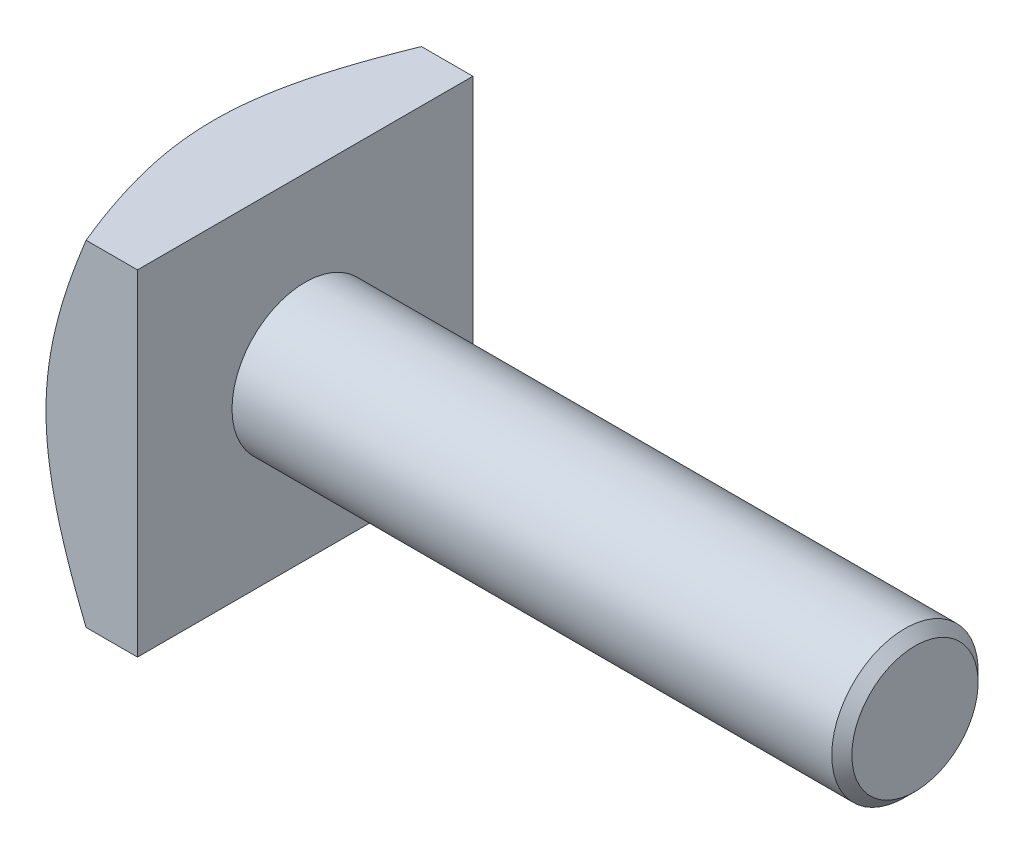
ISO-10303-21;
HEADER;
FILE_DESCRIPTION(('STEP AP214'),'2;1');
FILE_NAME('part.step','',(''),(''),'','','');
FILE_SCHEMA(('AUTOMOTIVE_DESIGN { 1 0 10303 214 1 1 1 1 }'));
ENDSEC;
DATA;
#1=APPLICATION_CONTEXT('core data for automotive mechanical design processes');
#2=APPLICATION_PROTOCOL_DEFINITION('international standard','automotive_design',2000,#1);
#3=PRODUCT_CONTEXT('',#1,'mechanical');
#4=PRODUCT('Part','Part','',(#3));
#5=PRODUCT_RELATED_PRODUCT_CATEGORY('part','',(#4));
#6=PRODUCT_DEFINITION_FORMATION('','',#4);
#7=PRODUCT_DEFINITION_CONTEXT('part definition',#1,'design');
#8=PRODUCT_DEFINITION('design','',#6,#7);
#9=PRODUCT_DEFINITION_SHAPE('','',#8);
#10=(LENGTH_UNIT() NAMED_UNIT(*) SI_UNIT(.MILLI.,.METRE.));
#11=(NAMED_UNIT(*) PLANE_ANGLE_UNIT() SI_UNIT($,.RADIAN.));
#12=(NAMED_UNIT(*) SI_UNIT($,.STERADIAN.) SOLID_ANGLE_UNIT());
#13=UNCERTAINTY_MEASURE_WITH_UNIT(LENGTH_MEASURE(1.E-05),#10,'distance_accuracy_value','');
#14=(GEOMETRIC_REPRESENTATION_CONTEXT(3) GLOBAL_UNCERTAINTY_ASSIGNED_CONTEXT((#13)) GLOBAL_UNIT_ASSIGNED_CONTEXT((#10,
#11,#12)) REPRESENTATION_CONTEXT('',''));
#15=CARTESIAN_POINT('',(0.,0.,0.));
#16=DIRECTION('',(0.,0.,1.));
#17=DIRECTION('',(1.,0.,0.));
#18=AXIS2_PLACEMENT_3D('',#15,#16,#17);
#19=CARTESIAN_POINT('',(15.,27.5,27.5));
#20=DIRECTION('',(0.,-1.,0.));
#21=DIRECTION('',(0.,0.,-1.));
#22=AXIS2_PLACEMENT_3D('',#19,#20,#21);
#23=PLANE('',#22);
#24=CARTESIAN_POINT('',(19.2891533938355,27.5,-54.3484403656074));
#25=CARTESIAN_POINT('',(18.9458184447502,27.5,-53.6819659629113));
#26=CARTESIAN_POINT('',(18.6034944439782,27.5,-53.0149710391168));
#27=CARTESIAN_POINT('',(17.9210859545558,27.5,-51.6798335462191));
#28=CARTESIAN_POINT('',(17.5810014742883,27.5,-51.0116909728319));
#29=CARTESIAN_POINT('',(16.5643984349443,27.5,-49.0053120943696));
#30=CARTESIAN_POINT('',(15.8915699938536,27.5,-47.6652016055824));
#31=CARTESIAN_POINT('',(14.5564181133558,27.5,-44.9758303666514));
#32=CARTESIAN_POINT('',(13.8941230365309,27.5,-43.6265555224847));
#33=CARTESIAN_POINT('',(12.5845998954245,27.5,-40.9207246375903));
#34=CARTESIAN_POINT('',(11.9373715231242,27.5,-39.564168746413));
#35=CARTESIAN_POINT('',(10.9630663542633,27.5,-37.4848533283862));
#36=CARTESIAN_POINT('',(10.6291345218302,27.5,-36.7653040431692));
#37=CARTESIAN_POINT('',(9.96729958555114,27.5,-35.3234400850026));
#38=CARTESIAN_POINT('',(9.63939644480553,27.5,-34.6011254290117));
#39=CARTESIAN_POINT('',(8.99043429087637,27.5,-33.1533670455752));
#40=CARTESIAN_POINT('',(8.66937573640514,27.5,-32.4279231123037));
#41=CARTESIAN_POINT('',(8.03511778044157,27.5,-30.9736050586348));
#42=CARTESIAN_POINT('',(7.72191836199072,27.5,-30.2447309456431));
#43=CARTESIAN_POINT('',(7.10481375884509,27.5,-28.7838030365384));
#44=CARTESIAN_POINT('',(6.80090069589717,27.5,-28.0517525733553));
#45=CARTESIAN_POINT('',(6.2034512453973,27.5,-26.5834130184237));
#46=CARTESIAN_POINT('',(5.90991496256234,27.5,-25.8471238839878));
#47=CARTESIAN_POINT('',(5.33486489109638,27.5,-24.3699401979915));
#48=CARTESIAN_POINT('',(5.05334990201111,27.5,-23.6290461147886));
#49=CARTESIAN_POINT('',(4.50421391071972,27.5,-22.1421407971614));
#50=CARTESIAN_POINT('',(4.23659244639665,27.5,-21.3961297338701));
#51=CARTESIAN_POINT('',(3.72031825451335,27.5,-19.9068050824168));
#52=CARTESIAN_POINT('',(3.47148826386457,27.5,-19.1635531323571));
#53=CARTESIAN_POINT('',(2.99205749021409,27.5,-17.6712555667686));
#54=CARTESIAN_POINT('',(2.76145481988805,27.5,-16.9222105599148));
#55=CARTESIAN_POINT('',(2.32125727796496,27.5,-15.4179904684064));
#56=CARTESIAN_POINT('',(2.11166123858363,27.5,-14.6628157270369));
#57=CARTESIAN_POINT('',(1.71648510883737,27.5,-13.1458870540646));
#58=CARTESIAN_POINT('',(1.53091357002427,27.5,-12.3841308821512));
#59=CARTESIAN_POINT('',(1.19051489867189,27.5,-10.8692661102743));
#60=CARTESIAN_POINT('',(1.03516105369305,27.5,-10.1162765420392));
#61=CARTESIAN_POINT('',(0.753974689267168,27.5,-8.60481213018964));
#62=CARTESIAN_POINT('',(0.628140351968641,27.5,-7.84633762731169));
#63=CARTESIAN_POINT('',(0.408972714915332,27.5,-6.32487928122566));
#64=CARTESIAN_POINT('',(0.315630951240227,27.5,-5.5618966650691));
#65=CARTESIAN_POINT('',(0.163897886928817,27.5,-4.03249534637066));
#66=CARTESIAN_POINT('',(0.105502560944068,27.5,-3.2660770498219));
#67=CARTESIAN_POINT('',(0.0411724393830715,27.5,-2.0349416906006));
#68=CARTESIAN_POINT('',(0.0236233132387049,27.5,-1.57080468576335));
#69=CARTESIAN_POINT('',(0.00207140960331185,27.5,-0.642221039917106));
#70=CARTESIAN_POINT('',(-0.0019317933397405,27.5,-0.17777440909115));
#71=CARTESIAN_POINT('',(0.00365633491252517,27.5,0.750991835121613));
#72=CARTESIAN_POINT('',(0.0132464133414229,27.5,1.21531145626937));
#73=CARTESIAN_POINT('',(0.045910875028161,27.5,2.14347939086826));
#74=CARTESIAN_POINT('',(0.0689854019921552,27.5,2.60732769924375));
#75=CARTESIAN_POINT('',(0.128376955017823,27.5,3.53428731510679));
#76=CARTESIAN_POINT('',(0.164697159750129,27.5,3.99739841886591));
#77=CARTESIAN_POINT('',(0.250192546716065,27.5,4.92243936230425));
#78=CARTESIAN_POINT('',(0.299368302481621,27.5,5.38436914835201));
#79=CARTESIAN_POINT('',(0.465466692163715,27.5,6.7679240387054));
#80=CARTESIAN_POINT('',(0.60096411289261,27.5,7.68737025571377));
#81=CARTESIAN_POINT('',(0.92090866704601,27.5,9.54355013412482));
#82=CARTESIAN_POINT('',(1.10659671725914,27.5,10.4800660544476));
#83=CARTESIAN_POINT('',(1.51905836353277,27.5,12.3439711470546));
#84=CARTESIAN_POINT('',(1.74583266961087,27.5,13.2713601613235));
#85=CARTESIAN_POINT('',(2.11237664753352,27.5,14.6555610773524));
#86=CARTESIAN_POINT('',(2.238987194182,27.5,15.1159192967937));
#87=CARTESIAN_POINT('',(2.50030239016658,27.5,16.0343381018087));
#88=CARTESIAN_POINT('',(2.63500703506466,27.5,16.4923986886419));
#89=CARTESIAN_POINT('',(2.91183323761131,27.5,17.406234327352));
#90=CARTESIAN_POINT('',(3.05395430288873,27.5,17.8620095287575));
#91=CARTESIAN_POINT('',(3.34500261076231,27.5,18.7713766461137));
#92=CARTESIAN_POINT('',(3.4939298481326,27.5,19.2249685637404));
#93=CARTESIAN_POINT('',(3.92985785110491,27.5,20.5225041386452));
#94=CARTESIAN_POINT('',(4.2246003215744,27.5,21.3638532083334));
#95=CARTESIAN_POINT('',(4.83246498379457,27.5,23.0399078511448));
#96=CARTESIAN_POINT('',(5.14558833761361,27.5,23.8746130004324));
#97=CARTESIAN_POINT('',(5.78748401731872,27.5,25.5382017544874));
#98=CARTESIAN_POINT('',(6.11626009867335,27.5,26.3670839068773));
#99=CARTESIAN_POINT('',(6.78704116362549,27.5,28.0194458710301));
#100=CARTESIAN_POINT('',(7.12904589555941,27.5,28.8429257852177));
#101=CARTESIAN_POINT('',(7.82467615727796,27.5,30.4858876974526));
#102=CARTESIAN_POINT('',(8.17831254721236,27.5,31.3053650887192));
#103=CARTESIAN_POINT('',(8.89526950579172,27.5,32.940069663424));
#104=CARTESIAN_POINT('',(9.2585901135639,27.5,33.755296829674));
#105=CARTESIAN_POINT('',(9.99351768487795,27.5,35.3818866438478));
#106=CARTESIAN_POINT('',(10.365123664427,27.5,36.1932497369353));
#107=CARTESIAN_POINT('',(11.1155341549093,27.5,37.8126348979688));
#108=CARTESIAN_POINT('',(11.4943386540273,27.5,38.620656971396));
#109=CARTESIAN_POINT('',(12.2594790323328,27.5,40.2364395282703));
#110=CARTESIAN_POINT('',(12.6458358878856,27.5,41.0441900703456));
#111=CARTESIAN_POINT('',(13.4240464742735,27.5,42.6570404282243));
#112=CARTESIAN_POINT('',(13.8159002288107,27.5,43.4621402325795));
#113=CARTESIAN_POINT('',(14.9986724868795,27.5,45.8739334176277));
#114=CARTESIAN_POINT('',(15.7967909834593,27.5,47.4770974428697));
#115=CARTESIAN_POINT('',(17.4074889977398,27.5,50.6750172800065));
#116=CARTESIAN_POINT('',(18.220060317763,27.5,52.2697772326246));
#117=CARTESIAN_POINT('',(19.8569996579239,27.5,55.4532089962213));
#118=CARTESIAN_POINT('',(20.6813675816418,27.5,57.0418808568266));
#119=CARTESIAN_POINT('',(22.227938537501,27.5,60.0006536521141));
#120=CARTESIAN_POINT('',(22.9489499056522,27.5,61.3713782989836));
#121=CARTESIAN_POINT('',(24.3969253120617,27.5,64.1096818457379));
#122=CARTESIAN_POINT('',(25.1238893613718,27.5,65.4772607397762));
#123=CARTESIAN_POINT('',(26.5829525854266,27.5,68.2099451596322));
#124=CARTESIAN_POINT('',(27.3150525323152,27.5,69.5750502729572));
#125=CARTESIAN_POINT('',(28.7835313114381,27.5,72.302957350948));
#126=CARTESIAN_POINT('',(29.5199101463377,27.5,73.6657593141785));
#127=CARTESIAN_POINT('',(30.9913075436608,27.5,76.3800929813567));
#128=CARTESIAN_POINT('',(31.7263011803049,27.5,77.7316382016354));
#129=CARTESIAN_POINT('',(33.1994205632285,27.5,80.4330209271446));
#130=CARTESIAN_POINT('',(33.9375463107573,27.5,81.7828584316936));
#131=CARTESIAN_POINT('',(35.4163878979718,27.5,84.4807988250746));
#132=CARTESIAN_POINT('',(36.1571032496777,27.5,85.8289019814607));
#133=CARTESIAN_POINT('',(37.640926392475,27.5,88.5237882457102));
#134=CARTESIAN_POINT('',(38.3840341796399,27.5,89.8705713557351));
#135=CARTESIAN_POINT('',(39.1281747867843,27.5,91.2167827597177));
#136=B_SPLINE_CURVE_WITH_KNOTS('',3,(#24,#25,#26,#27,#28,#29,#30,#31,#32,#33,#34,#35,#36,#37,
#38,#39,#40,#41,#42,#43,#44,#45,#46,#47,#48,#49,#50,#51,#52,#53,#54,#55,#56,#57,#58,#59,#60,#61,
#62,#63,#64,#65,#66,#67,#68,#69,#70,#71,#72,#73,#74,#75,#76,#77,#78,#79,#80,#81,#82,#83,#84,#85,
#86,#87,#88,#89,#90,#91,#92,#93,#94,#95,#96,#97,#98,#99,#100,#101,#102,#103,#104,#105,#106,#107,
#108,#109,#110,#111,#112,#113,#114,#115,#116,#117,#118,#119,#120,#121,#122,#123,#124,#125,#126,
#127,#128,#129,#130,#131,#132,#133,#134,#135),.UNSPECIFIED.,.F.,.F.,(4,2,2,2,2,2,2,2,2,2,2,2,2,
2,2,2,2,2,2,2,2,2,2,2,2,2,2,2,2,2,2,2,2,2,2,2,2,2,2,2,2,2,2,2,2,2,2,2,2,2,2,2,2,2,2,4),(0.,
2.2491320729525,4.49827255999688,8.99681337923128,13.5059126454325,18.0149196479463,
20.3946776667976,22.7744211150652,25.1543235514143,27.5342208519521,29.9120396626853,
32.2898824622634,34.6674872509384,37.0450129066101,39.3962057141665,41.7471547507148,
44.0979730225591,46.4496257838736,48.7556452282316,51.0615226274723,53.3667989234257,
55.6718096321565,57.0650406243832,58.4582278574329,59.8512867017104,61.2443603923332,
62.6377686101491,64.0312390034812,66.8180129117141,69.681239781468,72.5445161357838,
73.9768128496618,75.4091087782122,76.8413097382785,78.2735095987037,80.9476779010213,
83.6220154509301,86.2969979049348,88.9719294947277,91.6494337461398,94.3269488171325,
97.004147575498,99.6813419400428,102.367503498776,105.053676643584,110.426099759885,
115.795567103035,121.164990583723,125.811337727582,130.457693499837,135.104763463155,
139.751836321485,144.367241792768,148.982649105056,153.597229122809,158.211801571256),.UNSPECIFIED.);
#137=CARTESIAN_POINT('',(6.57652357279771,27.5,27.5));
#138=VERTEX_POINT('',#137);
#139=CARTESIAN_POINT('',(0.,27.5,0.));
#140=VERTEX_POINT('',#139);
#141=EDGE_CURVE('E85',#138,#140,#136,.F.);
#142=ORIENTED_EDGE('',*,*,#141,.F.);
#143=DIRECTION('',(-1.,0.,0.));
#144=VECTOR('',#143,1.);
#145=CARTESIAN_POINT('',(15.,27.5,27.5));
#146=LINE('',#145,#144);
#147=CARTESIAN_POINT('',(15.,27.5,27.5));
#148=VERTEX_POINT('',#147);
#149=EDGE_CURVE('E171',#148,#138,#146,.T.);
#150=ORIENTED_EDGE('',*,*,#149,.F.);
#151=DIRECTION('',(0.,0.,1.));
#152=VECTOR('',#151,1.);
#153=CARTESIAN_POINT('',(15.,27.5,27.5));
#154=LINE('',#153,#152);
#155=CARTESIAN_POINT('',(15.,27.5,-27.5));
#156=VERTEX_POINT('',#155);
#157=EDGE_CURVE('E184',#156,#148,#154,.T.);
#158=ORIENTED_EDGE('',*,*,#157,.F.);
#159=DIRECTION('',(-1.,0.,0.));
#160=VECTOR('',#159,1.);
#161=CARTESIAN_POINT('',(15.,27.5,-27.5));
#162=LINE('',#161,#160);
#163=CARTESIAN_POINT('',(6.57652357279771,27.5,-27.5));
#164=VERTEX_POINT('',#163);
#165=EDGE_CURVE('E110',#156,#164,#162,.T.);
#166=ORIENTED_EDGE('',*,*,#165,.T.);
#167=EDGE_CURVE('E94',#140,#164,#136,.F.);
#168=ORIENTED_EDGE('',*,*,#167,.F.);
#169=EDGE_LOOP('',(#142,#150,#158,#166,#168));
#170=FACE_BOUND('',#169,.T.);
#171=ADVANCED_FACE('F34',(#170),#23,.F.);
#172=CARTESIAN_POINT('',(15.,27.5,27.5));
#173=DIRECTION('',(0.,0.,-1.));
#174=DIRECTION('',(0.,1.,0.));
#175=AXIS2_PLACEMENT_3D('',#172,#173,#174);
#176=PLANE('',#175);
#177=CARTESIAN_POINT('',(19.2891533938355,-54.3484403656074,27.5));
#178=CARTESIAN_POINT('',(18.9458184447502,-53.6819659629113,27.5));
#179=CARTESIAN_POINT('',(18.6034944439782,-53.0149710391168,27.5));
#180=CARTESIAN_POINT('',(17.9210859545558,-51.6798335462191,27.5));
#181=CARTESIAN_POINT('',(17.5810014742883,-51.0116909728319,27.5));
#182=CARTESIAN_POINT('',(16.5643984349443,-49.0053120943696,27.5));
#183=CARTESIAN_POINT('',(15.8915699938536,-47.6652016055824,27.5));
#184=CARTESIAN_POINT('',(14.5564181133559,-44.9758303666514,27.5));
#185=CARTESIAN_POINT('',(13.8941230365309,-43.6265555224847,27.5));
#186=CARTESIAN_POINT('',(12.5845998954245,-40.9207246375903,27.5));
#187=CARTESIAN_POINT('',(11.9373715231242,-39.564168746413,27.5));
#188=CARTESIAN_POINT('',(10.9630663542633,-37.4848533283862,27.5));
#189=CARTESIAN_POINT('',(10.6291345218302,-36.7653040431692,27.5));
#190=CARTESIAN_POINT('',(9.96729958555114,-35.3234400850026,27.5));
#191=CARTESIAN_POINT('',(9.63939644480553,-34.6011254290117,27.5));
#192=CARTESIAN_POINT('',(8.99043429087637,-33.1533670455752,27.5));
#193=CARTESIAN_POINT('',(8.66937573640514,-32.4279231123037,27.5));
#194=CARTESIAN_POINT('',(8.03511778044157,-30.9736050586348,27.5));
#195=CARTESIAN_POINT('',(7.72191836199072,-30.2447309456431,27.5));
#196=CARTESIAN_POINT('',(7.10481375884509,-28.7838030365384,27.5));
#197=CARTESIAN_POINT('',(6.80090069589717,-28.0517525733553,27.5));
#198=CARTESIAN_POINT('',(6.20345124539731,-26.5834130184237,27.5));
#199=CARTESIAN_POINT('',(5.90991496256234,-25.8471238839878,27.5));
#200=CARTESIAN_POINT('',(5.33486489109638,-24.3699401979915,27.5));
#201=CARTESIAN_POINT('',(5.05334990201111,-23.6290461147886,27.5));
#202=CARTESIAN_POINT('',(4.50421391071971,-22.1421407971614,27.5));
#203=CARTESIAN_POINT('',(4.23659244639665,-21.3961297338701,27.5));
#204=CARTESIAN_POINT('',(3.72031825451334,-19.9068050824168,27.5));
#205=CARTESIAN_POINT('',(3.47148826386457,-19.1635531323571,27.5));
#206=CARTESIAN_POINT('',(2.99205749021408,-17.6712555667685,27.5));
#207=CARTESIAN_POINT('',(2.76145481988805,-16.9222105599148,27.5));
#208=CARTESIAN_POINT('',(2.32125727796496,-15.4179904684064,27.5));
#209=CARTESIAN_POINT('',(2.11166123858362,-14.6628157270369,27.5));
#210=CARTESIAN_POINT('',(1.71648510883737,-13.1458870540646,27.5));
#211=CARTESIAN_POINT('',(1.53091357002427,-12.3841308821512,27.5));
#212=CARTESIAN_POINT('',(1.19051489867189,-10.8692661102743,27.5));
#213=CARTESIAN_POINT('',(1.03516105369305,-10.1162765420392,27.5));
#214=CARTESIAN_POINT('',(0.753974689267168,-8.60481213018963,27.5));
#215=CARTESIAN_POINT('',(0.628140351968642,-7.84633762731168,27.5));
#216=CARTESIAN_POINT('',(0.408972714915334,-6.32487928122566,27.5));
#217=CARTESIAN_POINT('',(0.315630951240229,-5.56189666506909,27.5));
#218=CARTESIAN_POINT('',(0.163897886928819,-4.03249534637066,27.5));
#219=CARTESIAN_POINT('',(0.10550256094407,-3.2660770498219,27.5));
#220=CARTESIAN_POINT('',(0.0411724393830731,-2.0349416906006,27.5));
#221=CARTESIAN_POINT('',(0.0236233132387061,-1.57080468576335,27.5));
#222=CARTESIAN_POINT('',(0.00207140960331449,-0.642221039917105,27.5));
#223=CARTESIAN_POINT('',(-0.00193179333973604,-0.177774409091148,27.5));
#224=CARTESIAN_POINT('',(0.00365633491252874,0.750991835121612,27.5));
#225=CARTESIAN_POINT('',(0.0132464133414237,1.21531145626936,27.5));
#226=CARTESIAN_POINT('',(0.0459108750281606,2.14347939086825,27.5));
#227=CARTESIAN_POINT('',(0.0689854019921565,2.60732769924375,27.5));
#228=CARTESIAN_POINT('',(0.128376955017826,3.5342873151068,27.5));
#229=CARTESIAN_POINT('',(0.164697159750131,3.99739841886591,27.5));
#230=CARTESIAN_POINT('',(0.250192546716067,4.92243936230425,27.5));
#231=CARTESIAN_POINT('',(0.299368302481623,5.38436914835202,27.5));
#232=CARTESIAN_POINT('',(0.465466692163717,6.7679240387054,27.5));
#233=CARTESIAN_POINT('',(0.600964112892613,7.68737025571377,27.5));
#234=CARTESIAN_POINT('',(0.920908667046012,9.54355013412482,27.5));
#235=CARTESIAN_POINT('',(1.10659671725914,10.4800660544476,27.5));
#236=CARTESIAN_POINT('',(1.51905836353277,12.3439711470546,27.5));
#237=CARTESIAN_POINT('',(1.74583266961087,13.2713601613235,27.5));
#238=CARTESIAN_POINT('',(2.11237664753352,14.6555610773524,27.5));
#239=CARTESIAN_POINT('',(2.238987194182,15.1159192967937,27.5));
#240=CARTESIAN_POINT('',(2.50030239016658,16.0343381018087,27.5));
#241=CARTESIAN_POINT('',(2.63500703506466,16.4923986886419,27.5));
#242=CARTESIAN_POINT('',(2.9118332376113,17.406234327352,27.5));
#243=CARTESIAN_POINT('',(3.05395430288873,17.8620095287575,27.5));
#244=CARTESIAN_POINT('',(3.34500261076231,18.7713766461137,27.5));
#245=CARTESIAN_POINT('',(3.4939298481326,19.2249685637404,27.5));
#246=CARTESIAN_POINT('',(3.92985785110491,20.5225041386452,27.5));
#247=CARTESIAN_POINT('',(4.2246003215744,21.3638532083334,27.5));
#248=CARTESIAN_POINT('',(4.83246498379457,23.0399078511448,27.5));
#249=CARTESIAN_POINT('',(5.14558833761362,23.8746130004324,27.5));
#250=CARTESIAN_POINT('',(5.78748401731873,25.5382017544874,27.5));
#251=CARTESIAN_POINT('',(6.11626009867335,26.3670839068773,27.5));
#252=CARTESIAN_POINT('',(6.78704116362549,28.0194458710301,27.5));
#253=CARTESIAN_POINT('',(7.12904589555942,28.8429257852177,27.5));
#254=CARTESIAN_POINT('',(7.82467615727796,30.4858876974526,27.5));
#255=CARTESIAN_POINT('',(8.17831254721236,31.3053650887192,27.5));
#256=CARTESIAN_POINT('',(8.89526950579172,32.940069663424,27.5));
#257=CARTESIAN_POINT('',(9.2585901135639,33.755296829674,27.5));
#258=CARTESIAN_POINT('',(9.99351768487795,35.3818866438478,27.5));
#259=CARTESIAN_POINT('',(10.365123664427,36.1932497369353,27.5));
#260=CARTESIAN_POINT('',(11.1155341549093,37.8126348979688,27.5));
#261=CARTESIAN_POINT('',(11.4943386540273,38.620656971396,27.5));
#262=CARTESIAN_POINT('',(12.2594790323328,40.2364395282703,27.5));
#263=CARTESIAN_POINT('',(12.6458358878856,41.0441900703456,27.5));
#264=CARTESIAN_POINT('',(13.4240464742735,42.6570404282243,27.5));
#265=CARTESIAN_POINT('',(13.8159002288107,43.4621402325795,27.5));
#266=CARTESIAN_POINT('',(14.9986724868795,45.8739334176277,27.5));
#267=CARTESIAN_POINT('',(15.7967909834593,47.4770974428697,27.5));
#268=CARTESIAN_POINT('',(17.4074889977399,50.6750172800065,27.5));
#269=CARTESIAN_POINT('',(18.220060317763,52.2697772326247,27.5));
#270=CARTESIAN_POINT('',(19.8569996579239,55.4532089962213,27.5));
#271=CARTESIAN_POINT('',(20.6813675816418,57.0418808568266,27.5));
#272=CARTESIAN_POINT('',(22.227938537501,60.0006536521141,27.5));
#273=CARTESIAN_POINT('',(22.9489499056522,61.3713782989837,27.5));
#274=CARTESIAN_POINT('',(24.3969253120617,64.109681845738,27.5));
#275=CARTESIAN_POINT('',(25.1238893613718,65.4772607397762,27.5));
#276=CARTESIAN_POINT('',(26.5829525854266,68.2099451596322,27.5));
#277=CARTESIAN_POINT('',(27.3150525323152,69.5750502729572,27.5));
#278=CARTESIAN_POINT('',(28.7835313114381,72.302957350948,27.5));
#279=CARTESIAN_POINT('',(29.5199101463377,73.6657593141785,27.5));
#280=CARTESIAN_POINT('',(30.9913075436608,76.3800929813567,27.5));
#281=CARTESIAN_POINT('',(31.7263011803049,77.7316382016355,27.5));
#282=CARTESIAN_POINT('',(33.1994205632285,80.4330209271446,27.5));
#283=CARTESIAN_POINT('',(33.9375463107573,81.7828584316936,27.5));
#284=CARTESIAN_POINT('',(35.4163878979718,84.4807988250746,27.5));
#285=CARTESIAN_POINT('',(36.1571032496778,85.8289019814607,27.5));
#286=CARTESIAN_POINT('',(37.640926392475,88.5237882457102,27.5));
#287=CARTESIAN_POINT('',(38.3840341796399,89.8705713557351,27.5));
#288=CARTESIAN_POINT('',(39.1281747867843,91.2167827597177,27.5));
#289=B_SPLINE_CURVE_WITH_KNOTS('',3,(#177,#178,#179,#180,#181,#182,#183,#184,#185,#186,#187,
#188,#189,#190,#191,#192,#193,#194,#195,#196,#197,#198,#199,#200,#201,#202,#203,#204,#205,#206,
#207,#208,#209,#210,#211,#212,#213,#214,#215,#216,#217,#218,#219,#220,#221,#222,#223,#224,#225,
#226,#227,#228,#229,#230,#231,#232,#233,#234,#235,#236,#237,#238,#239,#240,#241,#242,#243,#244,
#245,#246,#247,#248,#249,#250,#251,#252,#253,#254,#255,#256,#257,#258,#259,#260,#261,#262,#263,
#264,#265,#266,#267,#268,#269,#270,#271,#272,#273,#274,#275,#276,#277,#278,#279,#280,#281,#282,
#283,#284,#285,#286,#287,#288),.UNSPECIFIED.,.F.,.F.,(4,2,2,2,2,2,2,2,2,2,2,2,2,2,2,2,2,2,2,2,2,
2,2,2,2,2,2,2,2,2,2,2,2,2,2,2,2,2,2,2,2,2,2,2,2,2,2,2,2,2,2,2,2,2,2,4),(0.,2.2491320729525,
4.49827255999688,8.99681337923127,13.5059126454325,18.0149196479463,20.3946776667976,
22.7744211150652,25.1543235514143,27.5342208519521,29.9120396626853,32.2898824622634,
34.6674872509384,37.0450129066102,39.3962057141665,41.7471547507148,44.0979730225591,
46.4496257838736,48.7556452282316,51.0615226274723,53.3667989234257,55.6718096321565,
57.0650406243832,58.4582278574329,59.8512867017104,61.2443603923333,62.6377686101491,
64.0312390034812,66.8180129117141,69.681239781468,72.5445161357838,73.9768128496618,
75.4091087782122,76.8413097382785,78.2735095987037,80.9476779010213,83.6220154509301,
86.2969979049348,88.9719294947277,91.6494337461398,94.3269488171326,97.0041475754981,
99.6813419400428,102.367503498776,105.053676643584,110.426099759885,115.795567103035,
121.164990583723,125.811337727582,130.457693499837,135.104763463155,139.751836321485,
144.367241792768,148.982649105056,153.597229122809,158.211801571256),.UNSPECIFIED.);
#290=CARTESIAN_POINT('',(6.57652357279771,-27.5,27.5));
#291=VERTEX_POINT('',#290);
#292=CARTESIAN_POINT('',(0.,0.,27.5));
#293=VERTEX_POINT('',#292);
#294=EDGE_CURVE('E162',#291,#293,#289,.T.);
#295=ORIENTED_EDGE('',*,*,#294,.F.);
#296=DIRECTION('',(-1.,0.,0.));
#297=VECTOR('',#296,1.);
#298=CARTESIAN_POINT('',(15.,-27.5,27.5));
#299=LINE('',#298,#297);
#300=CARTESIAN_POINT('',(15.,-27.5,27.5));
#301=VERTEX_POINT('',#300);
#302=EDGE_CURVE('E164',#301,#291,#299,.T.);
#303=ORIENTED_EDGE('',*,*,#302,.F.);
#304=DIRECTION('',(0.,-1.,0.));
#305=VECTOR('',#304,1.);
#306=CARTESIAN_POINT('',(15.,27.5,27.5));
#307=LINE('',#306,#305);
#308=EDGE_CURVE('E182',#148,#301,#307,.T.);
#309=ORIENTED_EDGE('',*,*,#308,.F.);
#310=ORIENTED_EDGE('',*,*,#149,.T.);
#311=EDGE_CURVE('E88',#293,#138,#289,.T.);
#312=ORIENTED_EDGE('',*,*,#311,.F.);
#313=EDGE_LOOP('',(#295,#303,#309,#310,#312));
#314=FACE_BOUND('',#313,.T.);
#315=ADVANCED_FACE('F152',(#314),#176,.F.);
#316=CARTESIAN_POINT('',(15.,-27.5,27.5));
#317=DIRECTION('',(0.,1.,0.));
#318=DIRECTION('',(0.,0.,1.));
#319=AXIS2_PLACEMENT_3D('',#316,#317,#318);
#320=PLANE('',#319);
#321=CARTESIAN_POINT('',(19.2891533938355,-27.5,-54.3484403656074));
#322=CARTESIAN_POINT('',(18.9458184447502,-27.5,-53.6819659629113));
#323=CARTESIAN_POINT('',(18.6034944439782,-27.5,-53.0149710391168));
#324=CARTESIAN_POINT('',(17.9210859545558,-27.5,-51.6798335462191));
#325=CARTESIAN_POINT('',(17.5810014742883,-27.5,-51.0116909728319));
#326=CARTESIAN_POINT('',(16.5643984349443,-27.5,-49.0053120943696));
#327=CARTESIAN_POINT('',(15.8915699938536,-27.5,-47.6652016055824));
#328=CARTESIAN_POINT('',(14.5564181133558,-27.5,-44.9758303666514));
#329=CARTESIAN_POINT('',(13.8941230365309,-27.5,-43.6265555224847));
#330=CARTESIAN_POINT('',(12.5845998954245,-27.5,-40.9207246375903));
#331=CARTESIAN_POINT('',(11.9373715231242,-27.5,-39.564168746413));
#332=CARTESIAN_POINT('',(10.9630663542633,-27.5,-37.4848533283862));
#333=CARTESIAN_POINT('',(10.6291345218302,-27.5,-36.7653040431692));
#334=CARTESIAN_POINT('',(9.96729958555114,-27.5,-35.3234400850026));
#335=CARTESIAN_POINT('',(9.63939644480553,-27.5,-34.6011254290117));
#336=CARTESIAN_POINT('',(8.99043429087637,-27.5,-33.1533670455752));
#337=CARTESIAN_POINT('',(8.66937573640514,-27.5,-32.4279231123037));
#338=CARTESIAN_POINT('',(8.03511778044157,-27.5,-30.9736050586348));
#339=CARTESIAN_POINT('',(7.72191836199072,-27.5,-30.2447309456431));
#340=CARTESIAN_POINT('',(7.10481375884509,-27.5,-28.7838030365384));
#341=CARTESIAN_POINT('',(6.80090069589717,-27.5,-28.0517525733553));
#342=CARTESIAN_POINT('',(6.2034512453973,-27.5,-26.5834130184237));
#343=CARTESIAN_POINT('',(5.90991496256234,-27.5,-25.8471238839878));
#344=CARTESIAN_POINT('',(5.33486489109638,-27.5,-24.3699401979915));
#345=CARTESIAN_POINT('',(5.05334990201111,-27.5,-23.6290461147886));
#346=CARTESIAN_POINT('',(4.50421391071972,-27.5,-22.1421407971614));
#347=CARTESIAN_POINT('',(4.23659244639665,-27.5,-21.3961297338701));
#348=CARTESIAN_POINT('',(3.72031825451335,-27.5,-19.9068050824168));
#349=CARTESIAN_POINT('',(3.47148826386457,-27.5,-19.1635531323571));
#350=CARTESIAN_POINT('',(2.99205749021409,-27.5,-17.6712555667686));
#351=CARTESIAN_POINT('',(2.76145481988805,-27.5,-16.9222105599148));
#352=CARTESIAN_POINT('',(2.32125727796496,-27.5,-15.4179904684064));
#353=CARTESIAN_POINT('',(2.11166123858363,-27.5,-14.6628157270369));
#354=CARTESIAN_POINT('',(1.71648510883737,-27.5,-13.1458870540646));
#355=CARTESIAN_POINT('',(1.53091357002427,-27.5,-12.3841308821512));
#356=CARTESIAN_POINT('',(1.19051489867189,-27.5,-10.8692661102743));
#357=CARTESIAN_POINT('',(1.03516105369305,-27.5,-10.1162765420392));
#358=CARTESIAN_POINT('',(0.753974689267168,-27.5,-8.60481213018964));
#359=CARTESIAN_POINT('',(0.628140351968641,-27.5,-7.84633762731169));
#360=CARTESIAN_POINT('',(0.408972714915332,-27.5,-6.32487928122566));
#361=CARTESIAN_POINT('',(0.315630951240227,-27.5,-5.5618966650691));
#362=CARTESIAN_POINT('',(0.163897886928817,-27.5,-4.03249534637066));
#363=CARTESIAN_POINT('',(0.105502560944068,-27.5,-3.2660770498219));
#364=CARTESIAN_POINT('',(0.0411724393830715,-27.5,-2.0349416906006));
#365=CARTESIAN_POINT('',(0.0236233132387049,-27.5,-1.57080468576335));
#366=CARTESIAN_POINT('',(0.00207140960331185,-27.5,-0.642221039917106));
#367=CARTESIAN_POINT('',(-0.0019317933397405,-27.5,-0.17777440909115));
#368=CARTESIAN_POINT('',(0.00365633491252517,-27.5,0.750991835121613));
#369=CARTESIAN_POINT('',(0.0132464133414229,-27.5,1.21531145626937));
#370=CARTESIAN_POINT('',(0.045910875028161,-27.5,2.14347939086826));
#371=CARTESIAN_POINT('',(0.0689854019921552,-27.5,2.60732769924375));
#372=CARTESIAN_POINT('',(0.128376955017823,-27.5,3.53428731510679));
#373=CARTESIAN_POINT('',(0.164697159750129,-27.5,3.99739841886591));
#374=CARTESIAN_POINT('',(0.250192546716065,-27.5,4.92243936230425));
#375=CARTESIAN_POINT('',(0.299368302481621,-27.5,5.38436914835201));
#376=CARTESIAN_POINT('',(0.465466692163715,-27.5,6.7679240387054));
#377=CARTESIAN_POINT('',(0.60096411289261,-27.5,7.68737025571377));
#378=CARTESIAN_POINT('',(0.92090866704601,-27.5,9.54355013412482));
#379=CARTESIAN_POINT('',(1.10659671725914,-27.5,10.4800660544476));
#380=CARTESIAN_POINT('',(1.51905836353277,-27.5,12.3439711470546));
#381=CARTESIAN_POINT('',(1.74583266961087,-27.5,13.2713601613235));
#382=CARTESIAN_POINT('',(2.11237664753352,-27.5,14.6555610773524));
#383=CARTESIAN_POINT('',(2.238987194182,-27.5,15.1159192967937));
#384=CARTESIAN_POINT('',(2.50030239016658,-27.5,16.0343381018087));
#385=CARTESIAN_POINT('',(2.63500703506466,-27.5,16.4923986886419));
#386=CARTESIAN_POINT('',(2.91183323761131,-27.5,17.406234327352));
#387=CARTESIAN_POINT('',(3.05395430288873,-27.5,17.8620095287575));
#388=CARTESIAN_POINT('',(3.34500261076231,-27.5,18.7713766461137));
#389=CARTESIAN_POINT('',(3.4939298481326,-27.5,19.2249685637404));
#390=CARTESIAN_POINT('',(3.92985785110491,-27.5,20.5225041386452));
#391=CARTESIAN_POINT('',(4.2246003215744,-27.5,21.3638532083334));
#392=CARTESIAN_POINT('',(4.83246498379457,-27.5,23.0399078511448));
#393=CARTESIAN_POINT('',(5.14558833761361,-27.5,23.8746130004324));
#394=CARTESIAN_POINT('',(5.78748401731872,-27.5,25.5382017544874));
#395=CARTESIAN_POINT('',(6.11626009867335,-27.5,26.3670839068773));
#396=CARTESIAN_POINT('',(6.78704116362549,-27.5,28.0194458710301));
#397=CARTESIAN_POINT('',(7.12904589555941,-27.5,28.8429257852177));
#398=CARTESIAN_POINT('',(7.82467615727796,-27.5,30.4858876974526));
#399=CARTESIAN_POINT('',(8.17831254721236,-27.5,31.3053650887192));
#400=CARTESIAN_POINT('',(8.89526950579172,-27.5,32.940069663424));
#401=CARTESIAN_POINT('',(9.2585901135639,-27.5,33.755296829674));
#402=CARTESIAN_POINT('',(9.99351768487795,-27.5,35.3818866438478));
#403=CARTESIAN_POINT('',(10.365123664427,-27.5,36.1932497369353));
#404=CARTESIAN_POINT('',(11.1155341549093,-27.5,37.8126348979688));
#405=CARTESIAN_POINT('',(11.4943386540273,-27.5,38.620656971396));
#406=CARTESIAN_POINT('',(12.2594790323328,-27.5,40.2364395282703));
#407=CARTESIAN_POINT('',(12.6458358878856,-27.5,41.0441900703456));
#408=CARTESIAN_POINT('',(13.4240464742735,-27.5,42.6570404282243));
#409=CARTESIAN_POINT('',(13.8159002288107,-27.5,43.4621402325795));
#410=CARTESIAN_POINT('',(14.9986724868795,-27.5,45.8739334176277));
#411=CARTESIAN_POINT('',(15.7967909834593,-27.5,47.4770974428697));
#412=CARTESIAN_POINT('',(17.4074889977398,-27.5,50.6750172800065));
#413=CARTESIAN_POINT('',(18.220060317763,-27.5,52.2697772326246));
#414=CARTESIAN_POINT('',(19.8569996579239,-27.5,55.4532089962213));
#415=CARTESIAN_POINT('',(20.6813675816418,-27.5,57.0418808568266));
#416=CARTESIAN_POINT('',(22.227938537501,-27.5,60.0006536521141));
#417=CARTESIAN_POINT('',(22.9489499056522,-27.5,61.3713782989836));
#418=CARTESIAN_POINT('',(24.3969253120617,-27.5,64.1096818457379));
#419=CARTESIAN_POINT('',(25.1238893613718,-27.5,65.4772607397762));
#420=CARTESIAN_POINT('',(26.5829525854266,-27.5,68.2099451596322));
#421=CARTESIAN_POINT('',(27.3150525323152,-27.5,69.5750502729572));
#422=CARTESIAN_POINT('',(28.7835313114381,-27.5,72.302957350948));
#423=CARTESIAN_POINT('',(29.5199101463377,-27.5,73.6657593141785));
#424=CARTESIAN_POINT('',(30.9913075436608,-27.5,76.3800929813567));
#425=CARTESIAN_POINT('',(31.7263011803049,-27.5,77.7316382016354));
#426=CARTESIAN_POINT('',(33.1994205632285,-27.5,80.4330209271446));
#427=CARTESIAN_POINT('',(33.9375463107573,-27.5,81.7828584316936));
#428=CARTESIAN_POINT('',(35.4163878979718,-27.5,84.4807988250746));
#429=CARTESIAN_POINT('',(36.1571032496777,-27.5,85.8289019814607));
#430=CARTESIAN_POINT('',(37.640926392475,-27.5,88.5237882457102));
#431=CARTESIAN_POINT('',(38.3840341796399,-27.5,89.8705713557351));
#432=CARTESIAN_POINT('',(39.1281747867843,-27.5,91.2167827597177));
#433=B_SPLINE_CURVE_WITH_KNOTS('',3,(#321,#322,#323,#324,#325,#326,#327,#328,#329,#330,#331,
#332,#333,#334,#335,#336,#337,#338,#339,#340,#341,#342,#343,#344,#345,#346,#347,#348,#349,#350,
#351,#352,#353,#354,#355,#356,#357,#358,#359,#360,#361,#362,#363,#364,#365,#366,#367,#368,#369,
#370,#371,#372,#373,#374,#375,#376,#377,#378,#379,#380,#381,#382,#383,#384,#385,#386,#387,#388,
#389,#390,#391,#392,#393,#394,#395,#396,#397,#398,#399,#400,#401,#402,#403,#404,#405,#406,#407,
#408,#409,#410,#411,#412,#413,#414,#415,#416,#417,#418,#419,#420,#421,#422,#423,#424,#425,#426,
#427,#428,#429,#430,#431,#432),.UNSPECIFIED.,.F.,.F.,(4,2,2,2,2,2,2,2,2,2,2,2,2,2,2,2,2,2,2,2,2,
2,2,2,2,2,2,2,2,2,2,2,2,2,2,2,2,2,2,2,2,2,2,2,2,2,2,2,2,2,2,2,2,2,2,4),(0.,2.2491320729525,
4.49827255999688,8.99681337923128,13.5059126454325,18.0149196479463,20.3946776667976,
22.7744211150652,25.1543235514143,27.5342208519521,29.9120396626853,32.2898824622634,
34.6674872509384,37.0450129066101,39.3962057141665,41.7471547507148,44.0979730225591,
46.4496257838736,48.7556452282316,51.0615226274723,53.3667989234257,55.6718096321565,
57.0650406243832,58.4582278574329,59.8512867017104,61.2443603923332,62.6377686101491,
64.0312390034812,66.8180129117141,69.681239781468,72.5445161357838,73.9768128496618,
75.4091087782122,76.8413097382785,78.2735095987037,80.9476779010213,83.6220154509301,
86.2969979049348,88.9719294947277,91.6494337461398,94.3269488171325,97.004147575498,
99.6813419400428,102.367503498776,105.053676643584,110.426099759885,115.795567103035,
121.164990583723,125.811337727582,130.457693499837,135.104763463155,139.751836321485,
144.367241792768,148.982649105056,153.597229122809,158.211801571256),.UNSPECIFIED.);
#434=CARTESIAN_POINT('',(6.57652357279771,-27.5,-27.5));
#435=VERTEX_POINT('',#434);
#436=CARTESIAN_POINT('',(0.,-27.5,0.));
#437=VERTEX_POINT('',#436);
#438=EDGE_CURVE('E111',#435,#437,#433,.T.);
#439=ORIENTED_EDGE('',*,*,#438,.F.);
#440=DIRECTION('',(-1.,0.,0.));
#441=VECTOR('',#440,1.);
#442=CARTESIAN_POINT('',(15.,-27.5,-27.5));
#443=LINE('',#442,#441);
#444=CARTESIAN_POINT('',(15.,-27.5,-27.5));
#445=VERTEX_POINT('',#444);
#446=EDGE_CURVE('E172',#445,#435,#443,.T.);
#447=ORIENTED_EDGE('',*,*,#446,.F.);
#448=DIRECTION('',(0.,0.,-1.));
#449=VECTOR('',#448,1.);
#450=CARTESIAN_POINT('',(15.,-27.5,27.5));
#451=LINE('',#450,#449);
#452=EDGE_CURVE('E170',#301,#445,#451,.T.);
#453=ORIENTED_EDGE('',*,*,#452,.F.);
#454=ORIENTED_EDGE('',*,*,#302,.T.);
#455=EDGE_CURVE('E93',#437,#291,#433,.T.);
#456=ORIENTED_EDGE('',*,*,#455,.F.);
#457=EDGE_LOOP('',(#439,#447,#453,#454,#456));
#458=FACE_BOUND('',#457,.T.);
#459=ADVANCED_FACE('F147',(#458),#320,.F.);
#460=CARTESIAN_POINT('',(15.,27.5,-27.5));
#461=DIRECTION('',(0.,0.,1.));
#462=DIRECTION('',(0.,-1.,0.));
#463=AXIS2_PLACEMENT_3D('',#460,#461,#462);
#464=PLANE('',#463);
#465=CARTESIAN_POINT('',(19.2891546449465,-54.3484427942103,-27.5));
#466=CARTESIAN_POINT('',(18.9458196711833,-53.6819683496807,-27.5));
#467=CARTESIAN_POINT('',(18.6034956457481,-53.0149733840404,-27.5));
#468=CARTESIAN_POINT('',(17.9210871070399,-51.6798358074194,-27.5));
#469=CARTESIAN_POINT('',(17.5810026021498,-51.0116931921547,-27.5));
#470=CARTESIAN_POINT('',(16.5643994890122,-49.0053141879964,-27.5));
#471=CARTESIAN_POINT('',(15.8915709988281,-47.6652036153328,-27.5));
#472=CARTESIAN_POINT('',(14.5564190202836,-44.9758322080444,-27.5));
#473=CARTESIAN_POINT('',(13.8941238945075,-43.6265572793954,-27.5));
#474=CARTESIAN_POINT('',(12.5846006560541,-40.9207262251849,-27.5));
#475=CARTESIAN_POINT('',(11.937372235358,-39.5641702491737,-27.5));
#476=CARTESIAN_POINT('',(10.9630669913177,-37.4848546970364,-27.5));
#477=CARTESIAN_POINT('',(10.6291351318106,-36.7653053627198,-27.5));
#478=CARTESIAN_POINT('',(9.96730014177546,-35.3234413061383,-27.5));
#479=CARTESIAN_POINT('',(9.63939697434785,-34.6011266008321,-27.5));
#480=CARTESIAN_POINT('',(8.99043476754519,-33.1533681184932,-27.5));
#481=CARTESIAN_POINT('',(8.66937618688255,-32.4279241356344,-27.5));
#482=CARTESIAN_POINT('',(8.03511817916339,-30.973605982472,-27.5));
#483=CARTESIAN_POINT('',(7.72191873514837,-30.2447318195739,-27.5));
#484=CARTESIAN_POINT('',(7.10481408169951,-28.7838038103329,-27.5));
#485=CARTESIAN_POINT('',(6.80090099401161,-28.0517532969204,-27.5));
#486=CARTESIAN_POINT('',(6.20345149503746,-26.5834136410651,-27.5));
#487=CARTESIAN_POINT('',(5.90991518846822,-25.8471244559349,-27.5));
#488=CARTESIAN_POINT('',(5.33486507081491,-24.3699406680087,-27.5));
#489=CARTESIAN_POINT('',(5.05335005927633,-23.6290465335704,-27.5));
#490=CARTESIAN_POINT('',(4.50421402469706,-22.1421411128281,-27.5));
#491=CARTESIAN_POINT('',(4.23659253953931,-21.3961299976574,-27.5));
#492=CARTESIAN_POINT('',(3.72031830293593,-19.9068052269561,-27.5));
#493=CARTESIAN_POINT('',(3.47148828870488,-19.1635532094231,-27.5));
#494=CARTESIAN_POINT('',(2.99205747120083,-17.6712555078401,-27.5));
#495=CARTESIAN_POINT('',(2.76145478060278,-16.9222104324654,-27.5));
#496=CARTESIAN_POINT('',(2.32125720222572,-15.4179902028011,-27.5));
#497=CARTESIAN_POINT('',(2.11166114666135,-14.6628153917969,-27.5));
#498=CARTESIAN_POINT('',(1.71648498948567,-13.1458865783026,-27.5));
#499=CARTESIAN_POINT('',(1.5309134394301,-12.3841303355011,-27.5));
#500=CARTESIAN_POINT('',(1.19051475194223,-10.8692654234376,-27.5));
#501=CARTESIAN_POINT('',(1.03516090191242,-10.1162757859345,-27.5));
#502=CARTESIAN_POINT('',(0.7539745338049,-8.60481123479225,-27.5));
#503=CARTESIAN_POINT('',(0.628140197874758,-7.84633666188965,-27.5));
#504=CARTESIAN_POINT('',(0.40897257064928,-6.32487817548455,-27.5));
#505=CARTESIAN_POINT('',(0.315630815427591,-5.56189548903427,-27.5));
#506=CARTESIAN_POINT('',(0.163897775444033,-4.0324940299073,-27.5));
#507=CARTESIAN_POINT('',(0.105502465331376,-3.26607566322387,-27.5));
#508=CARTESIAN_POINT('',(0.041172379119344,-2.03494026903871,-27.5));
#509=CARTESIAN_POINT('',(0.0236232679145103,-1.57080329923543,-27.5));
#510=CARTESIAN_POINT('',(0.00207139219584762,-0.642219723886365,-27.5));
#511=CARTESIAN_POINT('',(-0.00193179777000677,-0.177773128523602,-27.5));
#512=CARTESIAN_POINT('',(0.00365635432405217,0.750993044413734,-27.5));
#513=CARTESIAN_POINT('',(0.0132464436175062,1.21531262974929,-27.5));
#514=CARTESIAN_POINT('',(0.0459109248185776,2.14348049248271,-27.5));
#515=CARTESIAN_POINT('',(0.068985460432378,2.60732876480494,-27.5));
#516=CARTESIAN_POINT('',(0.128377028494809,3.53428830843509,-27.5));
#517=CARTESIAN_POINT('',(0.16469723961406,3.99739937601451,-27.5));
#518=CARTESIAN_POINT('',(0.250192637092899,4.9224402470617,-27.5));
#519=CARTESIAN_POINT('',(0.299368396984214,5.38436999689801,-27.5));
#520=CARTESIAN_POINT('',(0.465466795715535,6.76792477871997,-27.5));
#521=CARTESIAN_POINT('',(0.600964218040081,7.68737092349695,-27.5));
#522=CARTESIAN_POINT('',(0.920908767098935,9.54355065517786,-27.5));
#523=CARTESIAN_POINT('',(1.10659681033745,10.4800665010387,-27.5));
#524=CARTESIAN_POINT('',(1.51905843545301,12.343971446077,-27.5));
#525=CARTESIAN_POINT('',(1.74583272734727,13.2713603872393,-27.5));
#526=CARTESIAN_POINT('',(2.11237667962079,14.6555611945831,-27.5));
#527=CARTESIAN_POINT('',(2.23898721696822,15.1159193778857,-27.5));
#528=CARTESIAN_POINT('',(2.50030239306361,16.034338110983,-27.5));
#529=CARTESIAN_POINT('',(2.63500702737356,16.4923986620374,-27.5));
#530=CARTESIAN_POINT('',(2.91183320761369,17.4062342295416,-27.5));
#531=CARTESIAN_POINT('',(3.05395426117279,17.8620093955202,-27.5));
#532=CARTESIAN_POINT('',(3.34500254462047,18.7713764423534,-27.5));
#533=CARTESIAN_POINT('',(3.49392976928319,19.224968324884,-27.5));
#534=CARTESIAN_POINT('',(3.92985775998123,20.5225038751959,-27.5));
#535=CARTESIAN_POINT('',(4.22460023175511,21.3638529551209,-27.5));
#536=CARTESIAN_POINT('',(4.8324648972945,23.0399076181939,-27.5));
#537=CARTESIAN_POINT('',(5.1455882531285,23.8746127775062,-27.5));
#538=CARTESIAN_POINT('',(5.78748393743982,25.5382015514353,-27.5));
#539=CARTESIAN_POINT('',(6.11626002138612,26.3670837136745,-27.5));
#540=CARTESIAN_POINT('',(6.78704109197828,28.0194456973562,-27.5));
#541=CARTESIAN_POINT('',(7.12904582696053,28.8429256212234,-27.5));
#542=CARTESIAN_POINT('',(7.82467609516808,30.4858875527363,-27.5));
#543=CARTESIAN_POINT('',(8.17831248854425,31.305364953601,-27.5));
#544=CARTESIAN_POINT('',(8.89526945430335,32.9400695473787,-27.5));
#545=CARTESIAN_POINT('',(9.25859006581349,33.7552967231037,-27.5));
#546=CARTESIAN_POINT('',(9.99351764483863,35.3818865561158,-27.5));
#547=CARTESIAN_POINT('',(10.3651236283607,36.1932496585666,-27.5));
#548=CARTESIAN_POINT('',(11.1155341269821,37.8126348382393,-27.5));
#549=CARTESIAN_POINT('',(11.4943386302661,38.6206569209423,-27.5));
#550=CARTESIAN_POINT('',(12.259479017235,40.2364394966645,-27.5));
#551=CARTESIAN_POINT('',(12.6458358772885,41.0441900483103,-27.5));
#552=CARTESIAN_POINT('',(13.4240464728112,42.6570404252661,-27.5));
#553=CARTESIAN_POINT('',(13.8159002319825,43.4621402391278,-27.5));
#554=CARTESIAN_POINT('',(14.9986725041183,45.8739334526176,-27.5));
#555=CARTESIAN_POINT('',(15.7967910102939,47.4770974967144,-27.5));
#556=CARTESIAN_POINT('',(17.4074890440284,50.6750173713439,-27.5));
#557=CARTESIAN_POINT('',(18.2200603739091,52.2697773426003,-27.5));
#558=CARTESIAN_POINT('',(19.8569997339895,55.4532091433639,-27.5));
#559=CARTESIAN_POINT('',(20.6813676677692,57.041881022498,-27.5));
#560=CARTESIAN_POINT('',(22.2279386424343,60.0006538520868,-27.5));
#561=CARTESIAN_POINT('',(22.9489500193102,61.3713785147394,-27.5));
#562=CARTESIAN_POINT('',(24.3969254432491,64.1096820930155,-27.5));
#563=CARTESIAN_POINT('',(25.1238895013638,65.4772610027926,-27.5));
#564=CARTESIAN_POINT('',(26.5829527430968,68.2099454541087,-27.5));
#565=CARTESIAN_POINT('',(27.3150526988591,69.5750505831548,-27.5));
#566=CARTESIAN_POINT('',(28.7835314957753,72.3029576925618,-27.5));
#567=CARTESIAN_POINT('',(29.5199103395945,73.6657596714873,-27.5));
#568=CARTESIAN_POINT('',(30.9913077543468,76.3800933692196,-27.5));
#569=CARTESIAN_POINT('',(31.7263013994983,77.7316386043585,-27.5));
#570=CARTESIAN_POINT('',(33.1994207994606,80.433021359574,-27.5));
#571=CARTESIAN_POINT('',(33.9375465555205,81.7828588789693,-27.5));
#572=CARTESIAN_POINT('',(35.4163881598066,84.4807993020156,-27.5));
#573=CARTESIAN_POINT('',(36.1571035200529,85.8289024732209,-27.5));
#574=CARTESIAN_POINT('',(37.6409266799449,88.5237887671002,-27.5));
#575=CARTESIAN_POINT('',(38.3840344756643,89.8705718919358,-27.5));
#576=CARTESIAN_POINT('',(39.1281750913682,91.2167833107259,-27.5));
#577=B_SPLINE_CURVE_WITH_KNOTS('',3,(#465,#466,#467,#468,#469,#470,#471,#472,#473,#474,#475,
#476,#477,#478,#479,#480,#481,#482,#483,#484,#485,#486,#487,#488,#489,#490,#491,#492,#493,#494,
#495,#496,#497,#498,#499,#500,#501,#502,#503,#504,#505,#506,#507,#508,#509,#510,#511,#512,#513,
#514,#515,#516,#517,#518,#519,#520,#521,#522,#523,#524,#525,#526,#527,#528,#529,#530,#531,#532,
#533,#534,#535,#536,#537,#538,#539,#540,#541,#542,#543,#544,#545,#546,#547,#548,#549,#550,#551,
#552,#553,#554,#555,#556,#557,#558,#559,#560,#561,#562,#563,#564,#565,#566,#567,#568,#569,#570,
#571,#572,#573,#574,#575,#576),.UNSPECIFIED.,.F.,.F.,(4,2,2,2,2,2,2,2,2,2,2,2,2,2,2,2,2,2,2,2,2,
2,2,2,2,2,2,2,2,2,2,2,2,2,2,2,2,2,2,2,2,2,2,2,2,2,2,2,2,2,2,2,2,2,2,4),(0.,2.24913221842346,
4.49827285093895,8.99681396113497,13.5059135195607,18.0149208142877,20.3946790009406,
22.7744226170086,25.1543252211884,27.5342226895561,29.9120416679105,32.2898846351147,
34.6674895913804,37.0450154146281,39.3962084365403,41.7471576873704,44.0979761733873,
46.4496291491592,48.7556487999199,51.0615264055073,53.3668029074563,55.6718138220606,
57.0650447076123,58.4582318339841,59.8512905715695,61.2443641555045,62.637772266663,
64.0312425533225,66.8180162482529,69.6812428951005,72.5445190264896,73.976815628447,
75.4091114450771,76.8413122932281,78.2735120417369,80.9476803743105,83.6220179544904,
86.2970004388198,88.9719320589329,91.6494363408697,94.3269514423881,97.0041502312539,
99.6813446262985,102.367506216758,105.053679393293,110.426102573057,115.795569979451,
121.164993523381,125.811340721329,130.457696547674,135.104766565137,139.751839477613,
144.367245000253,148.982652363898,153.597232432952,158.2118049327),.UNSPECIFIED.);
#578=CARTESIAN_POINT('',(0.,0.,-27.5));
#579=VERTEX_POINT('',#578);
#580=EDGE_CURVE('E100',#164,#579,#577,.F.);
#581=ORIENTED_EDGE('',*,*,#580,.F.);
#582=ORIENTED_EDGE('',*,*,#165,.F.);
#583=DIRECTION('',(0.,1.,0.));
#584=VECTOR('',#583,1.);
#585=CARTESIAN_POINT('',(15.,27.5,-27.5));
#586=LINE('',#585,#584);
#587=EDGE_CURVE('E179',#445,#156,#586,.T.);
#588=ORIENTED_EDGE('',*,*,#587,.F.);
#589=ORIENTED_EDGE('',*,*,#446,.T.);
#590=EDGE_CURVE('E105',#579,#435,#577,.F.);
#591=ORIENTED_EDGE('',*,*,#590,.F.);
#592=EDGE_LOOP('',(#581,#582,#588,#589,#591));
#593=FACE_BOUND('',#592,.T.);
#594=ADVANCED_FACE('F142',(#593),#464,.F.);
#595=CARTESIAN_POINT('',(15.,27.5,-27.5));
#596=DIRECTION('',(-1.,0.,0.));
#597=DIRECTION('',(0.,0.,1.));
#598=AXIS2_PLACEMENT_3D('',#595,#596,#597);
#599=PLANE('',#598);
#600=CARTESIAN_POINT('',(15.,0.,0.));
#601=DIRECTION('',(-1.,0.,0.));
#602=DIRECTION('',(0.,0.,1.));
#603=AXIS2_PLACEMENT_3D('',#600,#601,#602);
#604=CIRCLE('',#603,12.);
#605=CARTESIAN_POINT('',(15.,0.,12.));
#606=VERTEX_POINT('',#605);
#607=EDGE_CURVE('E174',#606,#606,#604,.F.);
#608=ORIENTED_EDGE('',*,*,#607,.F.);
#609=EDGE_LOOP('',(#608));
#610=FACE_BOUND('',#609,.T.);
#611=ORIENTED_EDGE('',*,*,#157,.T.);
#612=ORIENTED_EDGE('',*,*,#308,.T.);
#613=ORIENTED_EDGE('',*,*,#452,.T.);
#614=ORIENTED_EDGE('',*,*,#587,.T.);
#615=EDGE_LOOP('',(#611,#612,#613,#614));
#616=FACE_BOUND('',#615,.T.);
#617=ADVANCED_FACE('F146',(#610,#616),#599,.F.);
#618=CARTESIAN_POINT('',(0.,0.,0.));
#619=DIRECTION('',(-1.,0.,0.));
#620=DIRECTION('',(0.,0.,1.));
#621=AXIS2_PLACEMENT_3D('',#618,#619,#620);
#622=CYLINDRICAL_SURFACE('',#621,12.);
#623=CARTESIAN_POINT('',(113.352,0.,0.));
#624=DIRECTION('',(-1.,0.,0.));
#625=DIRECTION('',(0.,0.,1.));
#626=AXIS2_PLACEMENT_3D('',#623,#624,#625);
#627=CIRCLE('',#626,12.);
#628=CARTESIAN_POINT('',(113.352,0.,12.));
#629=VERTEX_POINT('',#628);
#630=EDGE_CURVE('E187',#629,#629,#627,.T.);
#631=ORIENTED_EDGE('',*,*,#630,.T.);
#632=EDGE_LOOP('',(#631));
#633=FACE_BOUND('',#632,.T.);
#634=ORIENTED_EDGE('',*,*,#607,.T.);
#635=EDGE_LOOP('',(#634));
#636=FACE_BOUND('',#635,.T.);
#637=ADVANCED_FACE('F200',(#633,#636),#622,.T.);
#638=CARTESIAN_POINT('',(115.,0.,0.));
#639=DIRECTION('',(-1.,0.,0.));
#640=DIRECTION('',(0.,0.,1.));
#641=AXIS2_PLACEMENT_3D('',#638,#639,#640);
#642=CONICAL_SURFACE('',#641,10.352,0.785398163397441);
#643=ORIENTED_EDGE('',*,*,#630,.F.);
#644=EDGE_LOOP('',(#643));
#645=FACE_BOUND('',#644,.T.);
#646=CARTESIAN_POINT('',(115.,0.,0.));
#647=DIRECTION('',(-1.,0.,0.));
#648=DIRECTION('',(0.,0.,1.));
#649=AXIS2_PLACEMENT_3D('',#646,#647,#648);
#650=CIRCLE('',#649,10.352);
#651=CARTESIAN_POINT('',(115.,0.,10.352));
#652=VERTEX_POINT('',#651);
#653=EDGE_CURVE('E166',#652,#652,#650,.T.);
#654=ORIENTED_EDGE('',*,*,#653,.T.);
#655=EDGE_LOOP('',(#654));
#656=FACE_BOUND('',#655,.T.);
#657=ADVANCED_FACE('F194',(#645,#656),#642,.T.);
#658=CARTESIAN_POINT('',(115.,0.,0.));
#659=DIRECTION('',(-1.,0.,0.));
#660=DIRECTION('',(0.,0.,1.));
#661=AXIS2_PLACEMENT_3D('',#658,#659,#660);
#662=PLANE('',#661);
#663=ORIENTED_EDGE('',*,*,#653,.F.);
#664=EDGE_LOOP('',(#663));
#665=FACE_BOUND('',#664,.T.);
#666=ADVANCED_FACE('F132',(#665),#662,.F.);
#667=CARTESIAN_POINT('',(0.,0.,0.));
#668=DIRECTION('',(1.,0.,0.));
#669=DIRECTION('',(0.,0.,-1.));
#670=AXIS2_PLACEMENT_3D('',#667,#668,#669);
#671=CONICAL_SURFACE('',#670,27.5,1.0471975511966);
#672=ORIENTED_EDGE('',*,*,#294,.T.);
#673=CARTESIAN_POINT('',(0.,0.,0.));
#674=DIRECTION('',(-1.,0.,0.));
#675=DIRECTION('',(0.,0.,1.));
#676=AXIS2_PLACEMENT_3D('',#673,#674,#675);
#677=CIRCLE('',#676,27.5);
#678=EDGE_CURVE('E38',#437,#293,#677,.T.);
#679=ORIENTED_EDGE('',*,*,#678,.F.);
#680=ORIENTED_EDGE('',*,*,#455,.T.);
#681=EDGE_LOOP('',(#672,#679,#680));
#682=FACE_BOUND('',#681,.T.);
#683=ADVANCED_FACE('F127',(#682),#671,.T.);
#684=ORIENTED_EDGE('',*,*,#438,.T.);
#685=EDGE_CURVE('E43',#579,#437,#677,.T.);
#686=ORIENTED_EDGE('',*,*,#685,.F.);
#687=ORIENTED_EDGE('',*,*,#590,.T.);
#688=EDGE_LOOP('',(#684,#686,#687));
#689=FACE_BOUND('',#688,.T.);
#690=ADVANCED_FACE('F131',(#689),#671,.T.);
#691=ORIENTED_EDGE('',*,*,#167,.T.);
#692=ORIENTED_EDGE('',*,*,#580,.T.);
#693=EDGE_CURVE('E11',#140,#579,#677,.T.);
#694=ORIENTED_EDGE('',*,*,#693,.F.);
#695=EDGE_LOOP('',(#691,#692,#694));
#696=FACE_BOUND('',#695,.T.);
#697=ADVANCED_FACE('F98',(#696),#671,.T.);
#698=ORIENTED_EDGE('',*,*,#311,.T.);
#699=ORIENTED_EDGE('',*,*,#141,.T.);
#700=CARTESIAN_POINT('',(0.,0.,0.));
#701=DIRECTION('',(-1.,0.,0.));
#702=DIRECTION('',(0.,0.,1.));
#703=AXIS2_PLACEMENT_3D('',#700,#701,#702);
#704=CIRCLE('',#703,27.5);
#705=EDGE_CURVE('E50',#293,#140,#704,.T.);
#706=ORIENTED_EDGE('',*,*,#705,.F.);
#707=EDGE_LOOP('',(#698,#699,#706));
#708=FACE_BOUND('',#707,.T.);
#709=ADVANCED_FACE('F86',(#708),#671,.T.);
#710=CARTESIAN_POINT('',(0.,27.5,-27.5));
#711=DIRECTION('',(-1.,0.,0.));
#712=DIRECTION('',(0.,0.,1.));
#713=AXIS2_PLACEMENT_3D('',#710,#711,#712);
#714=PLANE('',#713);
#715=ORIENTED_EDGE('',*,*,#678,.T.);
#716=ORIENTED_EDGE('',*,*,#705,.T.);
#717=ORIENTED_EDGE('',*,*,#693,.T.);
#718=ORIENTED_EDGE('',*,*,#685,.T.);
#719=EDGE_LOOP('',(#715,#716,#717,#718));
#720=FACE_BOUND('',#719,.T.);
#721=ADVANCED_FACE('F103',(#720),#714,.T.);
#722=CLOSED_SHELL('',(#171,#315,#459,#594,#617,#637,#657,#666,#683,#690,#697,#709,#721));
#723=MANIFOLD_SOLID_BREP('B2',#722);
#724=ADVANCED_BREP_SHAPE_REPRESENTATION('',(#18,#723),#14);
#725=SHAPE_DEFINITION_REPRESENTATION(#9,#724);
ENDSEC;
END-ISO-10303-21;
